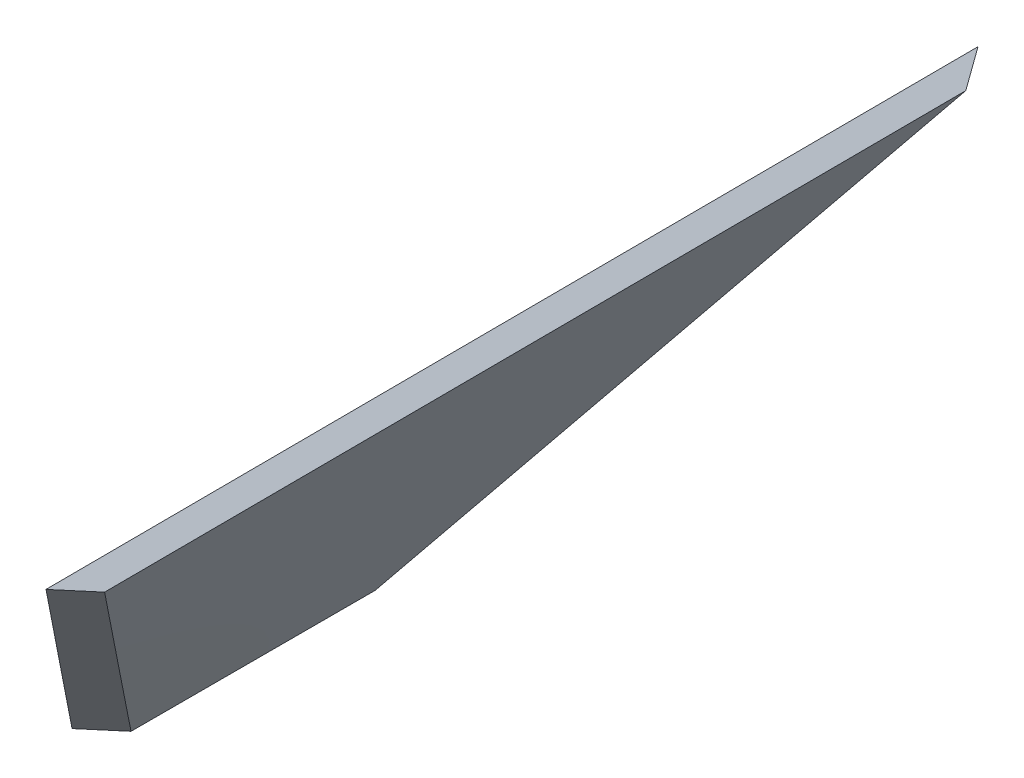
ISO-10303-21;
HEADER;
FILE_DESCRIPTION(('STEP AP214'),'2;1');
FILE_NAME('part.step','',(''),(''),'','','');
FILE_SCHEMA(('AUTOMOTIVE_DESIGN { 1 0 10303 214 1 1 1 1 }'));
ENDSEC;
DATA;
#1=APPLICATION_CONTEXT('core data for automotive mechanical design processes');
#2=APPLICATION_PROTOCOL_DEFINITION('international standard','automotive_design',2000,#1);
#3=PRODUCT_CONTEXT('',#1,'mechanical');
#4=PRODUCT('Part','Part','',(#3));
#5=PRODUCT_RELATED_PRODUCT_CATEGORY('part','',(#4));
#6=PRODUCT_DEFINITION_FORMATION('','',#4);
#7=PRODUCT_DEFINITION_CONTEXT('part definition',#1,'design');
#8=PRODUCT_DEFINITION('design','',#6,#7);
#9=PRODUCT_DEFINITION_SHAPE('','',#8);
#10=(LENGTH_UNIT() NAMED_UNIT(*) SI_UNIT(.MILLI.,.METRE.));
#11=(NAMED_UNIT(*) PLANE_ANGLE_UNIT() SI_UNIT($,.RADIAN.));
#12=(NAMED_UNIT(*) SI_UNIT($,.STERADIAN.) SOLID_ANGLE_UNIT());
#13=UNCERTAINTY_MEASURE_WITH_UNIT(LENGTH_MEASURE(1.E-05),#10,'distance_accuracy_value','');
#14=(GEOMETRIC_REPRESENTATION_CONTEXT(3) GLOBAL_UNCERTAINTY_ASSIGNED_CONTEXT((#13)) GLOBAL_UNIT_ASSIGNED_CONTEXT((#10,
#11,#12)) REPRESENTATION_CONTEXT('',''));
#15=CARTESIAN_POINT('',(0.,0.,0.));
#16=DIRECTION('',(0.,0.,1.));
#17=DIRECTION('',(1.,0.,0.));
#18=AXIS2_PLACEMENT_3D('',#15,#16,#17);
#19=CARTESIAN_POINT('',(255.683748074746,361.646186737307,597.997319736598));
#20=DIRECTION('',(-0.463959634932353,0.757671489646803,-0.458993868074326));
#21=DIRECTION('',(0.852811638118461,0.522218641844302,0.));
#22=AXIS2_PLACEMENT_3D('',#19,#20,#21);
#23=PLANE('',#22);
#24=CARTESIAN_POINT('',(85.6116867373077,31.4461867373069,224.84079999998));
#25=CARTESIAN_POINT('',(87.0565588673166,30.2878880010275,221.468266328822));
#26=CARTESIAN_POINT('',(88.5018005266442,29.1298559686928,218.095799384672));
#27=CARTESIAN_POINT('',(90.6702176814584,27.3932082761787,213.037199178424));
#28=CARTESIAN_POINT('',(91.3931158628378,26.81439242296,211.351015767494));
#29=CARTESIAN_POINT('',(92.8390971677843,25.6568942252864,207.978682388508));
#30=CARTESIAN_POINT('',(93.5621802913542,25.0782118808334,206.292532420452));
#31=CARTESIAN_POINT('',(94.2853559086845,24.4995963224338,204.606399203203));
#32=B_SPLINE_CURVE_WITH_KNOTS('',3,(#24,#25,#26,#27,#28,#29,#30,#31),.UNSPECIFIED.,.F.,.F.,(4,2,
2,4),(0.,11.5425149767635,17.3137727652761,23.0850306366586),.UNSPECIFIED.);
#33=CARTESIAN_POINT('',(85.6116867373077,31.4461867373068,224.84079999998));
#34=VERTEX_POINT('',#33);
#35=CARTESIAN_POINT('',(94.285355924013,24.4995963101699,204.606399133237));
#36=VERTEX_POINT('',#35);
#37=EDGE_CURVE('E99',#34,#36,#32,.T.);
#38=ORIENTED_EDGE('',*,*,#37,.T.);
#39=CARTESIAN_POINT('',(358.92026981327,354.715030361774,482.202486275097));
#40=CARTESIAN_POINT('',(347.891392345303,340.956005258965,470.638351215407));
#41=CARTESIAN_POINT('',(336.862607918635,327.196982025532,459.074125193643));
#42=CARTESIAN_POINT('',(314.80530488357,299.678940859668,435.945413206486));
#43=CARTESIAN_POINT('',(303.776786275174,285.919922927235,424.380927241093));
#44=CARTESIAN_POINT('',(281.720094689012,258.401894021288,401.251617427607));
#45=CARTESIAN_POINT('',(270.691921711246,244.642883047773,389.686793579513));
#46=CARTESIAN_POINT('',(254.150019907439,224.004373818465,372.33920821136));
#47=CARTESIAN_POINT('',(248.636112258375,217.124871957668,366.556621498115));
#48=CARTESIAN_POINT('',(237.608439459981,203.365871104043,354.991308764435));
#49=CARTESIAN_POINT('',(232.094674310651,196.486372111216,349.208582744001));
#50=CARTESIAN_POINT('',(215.553631934114,175.847879682878,331.860156384337));
#51=CARTESIAN_POINT('',(204.526608234026,162.088891366017,320.294208224598));
#52=CARTESIAN_POINT('',(182.473555166235,134.570934893792,297.161340096279));
#53=CARTESIAN_POINT('',(171.447525798529,120.811966738428,285.594420127702));
#54=CARTESIAN_POINT('',(154.909671051817,100.173538546136,268.24287768774));
#55=CARTESIAN_POINT('',(149.397250970578,93.2940664266607,262.458836407628));
#56=CARTESIAN_POINT('',(138.37293270181,79.5351328318868,250.890243878003));
#57=CARTESIAN_POINT('',(132.861034514281,72.6556713565878,245.105692628492));
#58=CARTESIAN_POINT('',(121.837920364888,58.896762257468,233.535923387881));
#59=CARTESIAN_POINT('',(116.326704403032,52.0173146336474,227.750705396774));
#60=CARTESIAN_POINT('',(105.305236604595,38.2584391571064,216.179327495199));
#61=CARTESIAN_POINT('',(99.7949847680189,31.3790113043861,210.393167584724));
#62=CARTESIAN_POINT('',(94.2853559425244,24.4995962953363,204.606399124266));
#63=B_SPLINE_CURVE_WITH_KNOTS('',3,(#39,#40,#41,#42,#43,#44,#45,#46,#47,#48,#49,#50,#51,#52,#53,
#54,#55,#56,#57,#58,#59,#60,#61,#62),.UNSPECIFIED.,.F.,.F.,(4,2,2,2,2,2,2,2,2,2,2,4),(0.,
63.2620357498309,126.524071717887,189.78610768251,221.417125568464,253.048143487038,
316.310181938092,379.572220176311,411.203239867122,442.834259501264,474.465279543079,
506.096299780958),.UNSPECIFIED.);
#64=CARTESIAN_POINT('',(358.920269813023,354.715030361971,482.202486275138));
#65=VERTEX_POINT('',#64);
#66=EDGE_CURVE('E219',#65,#36,#63,.T.);
#67=ORIENTED_EDGE('',*,*,#66,.F.);
#68=CARTESIAN_POINT('',(358.920269811262,354.715030365189,482.202486292587));
#69=CARTESIAN_POINT('',(358.196405083762,355.298372315029,483.897118030486));
#70=CARTESIAN_POINT('',(357.47255102983,355.881721957202,485.591751679707));
#71=CARTESIAN_POINT('',(355.662942576478,357.340115293348,489.828340580871));
#72=CARTESIAN_POINT('',(354.577201518018,358.215168602499,492.370298221353));
#73=CARTESIAN_POINT('',(352.405767422695,359.965309834519,497.454222098826));
#74=CARTESIAN_POINT('',(351.320074385833,360.840397757388,499.996188335817));
#75=CARTESIAN_POINT('',(350.234405357301,361.715502986283,502.538158868865));
#76=B_SPLINE_CURVE_WITH_KNOTS('',3,(#68,#69,#70,#71,#72,#73,#74,#75),.UNSPECIFIED.,.F.,.F.,(4,2,
2,4),(0.,5.79865521575473,14.4966380429352,23.1946208738173),.UNSPECIFIED.);
#77=CARTESIAN_POINT('',(350.320400258716,361.646186737307,502.336811715639));
#78=VERTEX_POINT('',#77);
#79=EDGE_CURVE('E211',#65,#78,#76,.T.);
#80=ORIENTED_EDGE('',*,*,#79,.T.);
#81=DIRECTION('',(0.523067455693957,0.652478989348328,0.54833530367179));
#82=VECTOR('',#81,1.);
#83=CARTESIAN_POINT('',(85.6116867373077,31.4461867373068,224.84079999998));
#84=LINE('',#83,#82);
#85=EDGE_CURVE('E144',#34,#78,#84,.T.);
#86=ORIENTED_EDGE('',*,*,#85,.F.);
#87=EDGE_LOOP('',(#38,#67,#80,#86));
#88=FACE_BOUND('',#87,.T.);
#89=ADVANCED_FACE('F41',(#88),#23,.F.);
#90=CARTESIAN_POINT('',(252.903016686641,361.646186737307,-51.3842000000199));
#91=DIRECTION('',(-0.599439623726809,0.526033966837768,0.603291308771462));
#92=DIRECTION('',(0.70936761741224,0.,0.704838693153889));
#93=AXIS2_PLACEMENT_3D('',#90,#91,#92);
#94=PLANE('',#93);
#95=CARTESIAN_POINT('',(94.304860970554,24.5240211053084,84.9805878131042));
#96=CARTESIAN_POINT('',(93.4303889102284,25.2208364465962,83.5041174446744));
#97=CARTESIAN_POINT('',(92.5558413778993,25.917562724937,82.0276497436559));
#98=CARTESIAN_POINT('',(90.8065953445564,27.3108370997331,79.074719700742));
#99=CARTESIAN_POINT('',(89.9318968435425,28.0073851961885,77.5982573588466));
#100=CARTESIAN_POINT('',(87.9087742541968,29.618111959535,74.1835938247066));
#101=CARTESIAN_POINT('',(86.7602955606541,30.5322261685133,72.2453945793234));
#102=CARTESIAN_POINT('',(85.6116867373077,31.4461867373068,70.3072000000031));
#103=B_SPLINE_CURVE_WITH_KNOTS('',3,(#95,#96,#97,#98,#99,#100,#101,#102),.UNSPECIFIED.,.F.,.F.,
(4,2,2,4),(0.,5.55625410942713,11.1125082188599,18.4064110991942),.UNSPECIFIED.);
#104=CARTESIAN_POINT('',(94.3048609872856,24.5240210919576,84.9805878771799));
#105=VERTEX_POINT('',#104);
#106=CARTESIAN_POINT('',(85.6116867373077,31.4461867373069,70.3072000000032));
#107=VERTEX_POINT('',#106);
#108=EDGE_CURVE('E93',#105,#107,#103,.T.);
#109=ORIENTED_EDGE('',*,*,#108,.T.);
#110=CARTESIAN_POINT('',(85.6116867373077,31.4461867373069,70.3072000000032));
#111=CARTESIAN_POINT('',(173.192933918056,141.512853403974,61.3577333837525));
#112=CARTESIAN_POINT('',(260.774181098805,251.57952007064,52.4082667675018));
#113=CARTESIAN_POINT('',(348.355428279554,361.646186737307,43.4588001512512));
#114=B_SPLINE_CURVE_WITH_KNOTS('',3,(#110,#111,#112,#113),.UNSPECIFIED.,.F.,.F.,(4,4),(0.,1.),.UNSPECIFIED.);
#115=CARTESIAN_POINT('',(348.355428279554,361.646186737307,43.4588001512512));
#116=VERTEX_POINT('',#115);
#117=EDGE_CURVE('E55',#116,#107,#114,.F.);
#118=ORIENTED_EDGE('',*,*,#117,.F.);
#119=CARTESIAN_POINT('',(348.267855212258,361.715396548804,43.3114393706436));
#120=CARTESIAN_POINT('',(349.153997588053,361.01507174552,44.8025655870863));
#121=CARTESIAN_POINT('',(350.040131281007,360.314736665407,46.2936921369052));
#122=CARTESIAN_POINT('',(351.812381282183,358.914045929324,49.2759459037175));
#123=CARTESIAN_POINT('',(352.698497590404,358.213690273355,50.7670731207108));
#124=CARTESIAN_POINT('',(354.760572252051,356.583857869968,54.2370990157827));
#125=CARTESIAN_POINT('',(355.936523981288,355.654373282568,56.2159979479603));
#126=CARTESIAN_POINT('',(357.112460362172,354.724870530214,58.1948974685286));
#127=B_SPLINE_CURVE_WITH_KNOTS('',3,(#119,#120,#121,#122,#123,#124,#125,#126),.UNSPECIFIED.,.F.,
.F.,(4,2,2,4),(0.,5.61181296927187,11.223625938543,18.67114938307),.UNSPECIFIED.);
#128=CARTESIAN_POINT('',(357.112460361956,354.724870530387,58.1948974685605));
#129=VERTEX_POINT('',#128);
#130=EDGE_CURVE('E61',#116,#129,#127,.T.);
#131=ORIENTED_EDGE('',*,*,#130,.T.);
#132=CARTESIAN_POINT('',(94.3048610044559,24.5240210782813,84.9805878703557));
#133=CARTESIAN_POINT('',(100.738161467734,32.6032944890206,84.3281716550605));
#134=CARTESIAN_POINT('',(107.171076861141,40.6828254278652,83.6751482792375));
#135=CARTESIAN_POINT('',(120.036326940221,56.8422755321543,82.3681860169654));
#136=CARTESIAN_POINT('',(126.468661625897,64.9221946975969,81.7142471305206));
#137=CARTESIAN_POINT('',(139.332939721525,81.0822944254595,80.4057526574462));
#138=CARTESIAN_POINT('',(145.764883131481,89.1624749878769,79.7511970708225));
#139=CARTESIAN_POINT('',(158.628478678002,105.323030772402,78.4416267521899));
#140=CARTESIAN_POINT('',(165.060130814567,113.403405994509,77.7866120201804));
#141=CARTESIAN_POINT('',(184.354764973938,137.644746444643,75.8210603525724));
#142=CARTESIAN_POINT('',(197.217425017063,153.805926796476,74.5100159178542));
#143=CARTESIAN_POINT('',(222.942228034198,186.128632993615,71.8871120308464));
#144=CARTESIAN_POINT('',(235.804371008205,202.290158838921,70.5752525785529));
#145=CARTESIAN_POINT('',(266.741194912394,241.163644387196,67.4192055749633));
#146=CARTESIAN_POINT('',(284.815711282716,263.875713996414,65.57475868275));
#147=CARTESIAN_POINT('',(311.927188783889,297.944016617368,62.8076203618809));
#148=CARTESIAN_POINT('',(320.964298400614,309.300150473664,61.8851629287145));
#149=CARTESIAN_POINT('',(339.03843613346,332.012472606491,60.0401196309235));
#150=CARTESIAN_POINT('',(348.07546424958,343.36866088302,59.117533766299));
#151=CARTESIAN_POINT('',(357.112460362172,354.724870530214,58.1948974685287));
#152=B_SPLINE_CURVE_WITH_KNOTS('',3,(#132,#133,#134,#135,#136,#137,#138,#139,#140,#141,#142,
#143,#144,#145,#146,#147,#148,#149,#150,#151),.UNSPECIFIED.,.F.,.F.,(4,2,2,2,2,2,2,2,2,4),(0.,
31.0449503049171,62.0899004607837,93.1348503185234,124.179800219281,186.269698714486,
248.359597500722,335.614133696545,379.241401395875,422.868669086589),.UNSPECIFIED.);
#153=EDGE_CURVE('E95',#105,#129,#152,.T.);
#154=ORIENTED_EDGE('',*,*,#153,.F.);
#155=EDGE_LOOP('',(#109,#118,#131,#154));
#156=FACE_BOUND('',#155,.T.);
#157=ADVANCED_FACE('F94',(#156),#94,.F.);
#158=CARTESIAN_POINT('',(85.6116867373077,31.4461867373069,224.84079999998));
#159=CARTESIAN_POINT('',(85.6116867373077,31.4461867373069,173.329599999988));
#160=CARTESIAN_POINT('',(85.6116867373077,31.4461867373069,121.818399999995));
#161=CARTESIAN_POINT('',(85.6116867373077,31.4461867373069,70.3072000000032));
#162=CARTESIAN_POINT('',(173.847924577777,141.512853403974,317.339470571867));
#163=CARTESIAN_POINT('',(173.62959435787,141.512853403974,232.012224842495));
#164=CARTESIAN_POINT('',(173.411264137963,141.512853403974,146.684979113124));
#165=CARTESIAN_POINT('',(173.192933918056,141.512853403974,61.3577333837525));
#166=CARTESIAN_POINT('',(262.084162418247,251.57952007064,409.838141143753));
#167=CARTESIAN_POINT('',(261.647501978433,251.57952007064,290.694849685003));
#168=CARTESIAN_POINT('',(261.210841538619,251.57952007064,171.551558226252));
#169=CARTESIAN_POINT('',(260.774181098805,251.57952007064,52.4082667675018));
#170=CARTESIAN_POINT('',(350.320400258716,361.646186737307,502.336811715639));
#171=CARTESIAN_POINT('',(349.665409598995,361.646186737307,349.37747452751));
#172=CARTESIAN_POINT('',(349.010418939275,361.646186737307,196.418137339381));
#173=CARTESIAN_POINT('',(348.355428279554,361.646186737307,43.4588001512512));
#174=B_SPLINE_SURFACE_WITH_KNOTS('',3,3,((#158,#159,#160,#161),(#162,#163,#164,#165),(#166,#167,
#168,#169),(#170,#171,#172,#173)),.UNSPECIFIED.,.F.,.F.,.F.,(4,4),(4,4),(0.,1.),(0.,1.),.UNSPECIFIED.);
#175=CARTESIAN_POINT('',(350.320400258716,361.646186737307,502.336811715639));
#176=CARTESIAN_POINT('',(349.665409598995,361.646186737307,349.37747452751));
#177=CARTESIAN_POINT('',(349.010418939275,361.646186737307,196.418137339381));
#178=CARTESIAN_POINT('',(348.355428279554,361.646186737307,43.4588001512512));
#179=B_SPLINE_CURVE_WITH_KNOTS('',3,(#175,#176,#177,#178),.UNSPECIFIED.,.F.,.F.,(4,4),(0.,1.),.UNSPECIFIED.);
#180=EDGE_CURVE('E88',#78,#116,#179,.T.);
#181=CARTESIAN_POINT('',(85.6116867373077,31.4461867373069,70.3072000000032));
#182=CARTESIAN_POINT('',(85.6116867373077,31.4461867373069,121.818399999995));
#183=CARTESIAN_POINT('',(85.6116867373077,31.4461867373069,173.329599999988));
#184=CARTESIAN_POINT('',(85.6116867373077,31.4461867373069,224.84079999998));
#185=B_SPLINE_CURVE_WITH_KNOTS('',3,(#181,#182,#183,#184),.UNSPECIFIED.,.F.,.F.,(4,4),(0.,1.),.UNSPECIFIED.);
#186=EDGE_CURVE('E11',#107,#34,#185,.T.);
#187=ORIENTED_EDGE('',*,*,#85,.T.);
#188=ORIENTED_EDGE('',*,*,#180,.T.);
#189=ORIENTED_EDGE('',*,*,#117,.T.);
#190=ORIENTED_EDGE('',*,*,#186,.T.);
#191=EDGE_LOOP('',(#187,#188,#189,#190));
#192=FACE_BOUND('',#191,.T.);
#193=ADVANCED_FACE('F85',(#192),#174,.T.);
#194=CARTESIAN_POINT('',(350.253195264404,361.715504021864,506.925963753832));
#195=CARTESIAN_POINT('',(350.246645074935,361.715503667409,505.396370383162));
#196=CARTESIAN_POINT('',(350.240094885465,361.715503312954,503.866777012492));
#197=CARTESIAN_POINT('',(350.233544695996,361.715502958499,502.337183641822));
#198=CARTESIAN_POINT('',(349.578525749051,361.715467513005,349.377846574822));
#199=CARTESIAN_POINT('',(348.923506796167,361.715432015562,196.418509507847));
#200=CARTESIAN_POINT('',(348.268487837452,361.715396466049,43.4591724408974));
#201=CARTESIAN_POINT('',(348.261937647864,361.715396110553,41.9295790702279));
#202=CARTESIAN_POINT('',(348.255387458277,361.715395755058,40.3999856995584));
#203=CARTESIAN_POINT('',(348.24883726869,361.715395399563,38.8703923288889));
#204=CARTESIAN_POINT('',(350.340049978508,361.646186737307,506.925591831283));
#205=CARTESIAN_POINT('',(350.333500071911,361.646186737307,505.395998459402));
#206=CARTESIAN_POINT('',(350.326950165314,361.646186737307,503.866405087521));
#207=CARTESIAN_POINT('',(350.320400258716,361.646186737307,502.336811715639));
#208=CARTESIAN_POINT('',(349.665409598995,361.646186737307,349.37747452751));
#209=CARTESIAN_POINT('',(349.010418939275,361.646186737307,196.418137339381));
#210=CARTESIAN_POINT('',(348.355428279554,361.646186737307,43.4588001512512));
#211=CARTESIAN_POINT('',(348.348878372957,361.646186737307,41.9292067793699));
#212=CARTESIAN_POINT('',(348.342328466359,361.646186737307,40.3996134074886));
#213=CARTESIAN_POINT('',(348.335778559762,361.646186737307,38.8700200356073));
#214=CARTESIAN_POINT('',(359.025521388904,354.714458281584,506.888399576442));
#215=CARTESIAN_POINT('',(359.01899976953,354.714493727079,505.358806083431));
#216=CARTESIAN_POINT('',(359.012478150157,354.714529172574,503.829212590421));
#217=CARTESIAN_POINT('',(359.005956530783,354.714564618068,502.29961909741));
#218=CARTESIAN_POINT('',(358.353794593399,354.718109167544,349.340269796345));
#219=CARTESIAN_POINT('',(357.701633250067,354.72165891179,196.380920492734));
#220=CARTESIAN_POINT('',(357.049472489765,354.725213863131,43.4215711866285));
#221=CARTESIAN_POINT('',(357.042950882162,354.725249412644,41.8919776935674));
#222=CARTESIAN_POINT('',(357.036429274559,354.725284962158,40.3623842005063));
#223=CARTESIAN_POINT('',(357.029907666956,354.725320511671,38.8327907074453));
#224=B_SPLINE_SURFACE_WITH_KNOTS('',1,3,((#194,#195,#196,#197,#198,#199,#200,#201,#202,#203),
(#204,#205,#206,#207,#208,#209,#210,#211,#212,#213),(#214,#215,#216,#217,#218,#219,#220,#221,
#222,#223)),.UNSPECIFIED.,.F.,.F.,.F.,(2,1,2),(4,3,3,4),(-0.01,0.,1.),(-0.01,0.,1.,1.01),.UNSPECIFIED.);
#225=CARTESIAN_POINT('',(358.920269812777,354.715030362167,482.20248627513));
#226=CARTESIAN_POINT('',(358.844944355998,354.715439814314,464.535503408457));
#227=CARTESIAN_POINT('',(358.769618907137,354.715849335768,446.868520541752));
#228=CARTESIAN_POINT('',(358.618968025219,354.716668517331,411.534554808275));
#229=CARTESIAN_POINT('',(358.543642592161,354.717078177439,393.867571941502));
#230=CARTESIAN_POINT('',(358.392991741815,354.717897636348,358.53360620789));
#231=CARTESIAN_POINT('',(358.317666324527,354.718307435149,340.86662334105));
#232=CARTESIAN_POINT('',(358.167015505685,354.719127171481,305.532657607302));
#233=CARTESIAN_POINT('',(358.091690104132,354.719537109012,287.865674740395));
#234=CARTESIAN_POINT('',(357.941039316727,354.720357122842,252.531709006513));
#235=CARTESIAN_POINT('',(357.865713930875,354.720767199141,234.864726139538));
#236=CARTESIAN_POINT('',(357.715063174838,354.721587490546,199.530760405521));
#237=CARTESIAN_POINT('',(357.639737804653,354.721997705651,181.86377753848));
#238=CARTESIAN_POINT('',(357.489087079917,354.722818274706,146.529811804329));
#239=CARTESIAN_POINT('',(357.413761725365,354.723228628655,128.86282893722));
#240=CARTESIAN_POINT('',(357.263111031861,354.724049475436,93.5288632029362));
#241=CARTESIAN_POINT('',(357.187785692909,354.724459968268,75.8618803357608));
#242=CARTESIAN_POINT('',(357.112460361739,354.72487053056,58.1948974685537));
#243=B_SPLINE_CURVE_WITH_KNOTS('',3,(#225,#226,#227,#228,#229,#230,#231,#232,#233,#234,#235,
#236,#237,#238,#239,#240,#241,#242),.UNSPECIFIED.,.F.,.F.,(4,2,2,2,2,2,2,2,4),(0.,
53.0014303517421,106.002860703495,159.004291055258,212.005721407032,265.007151758816,
318.008582110611,371.010012462416,424.011442814232),.UNSPECIFIED.);
#244=EDGE_CURVE('E241',#65,#129,#243,.T.);
#245=ORIENTED_EDGE('',*,*,#130,.F.);
#246=ORIENTED_EDGE('',*,*,#180,.F.);
#247=ORIENTED_EDGE('',*,*,#79,.F.);
#248=ORIENTED_EDGE('',*,*,#244,.T.);
#249=EDGE_LOOP('',(#245,#246,#247,#248));
#250=FACE_BOUND('',#249,.T.);
#251=ADVANCED_FACE('F125',(#250),#224,.T.);
#252=CARTESIAN_POINT('',(85.6116867373077,31.4461867373069,230.451572510383));
#253=CARTESIAN_POINT('',(85.6116867373077,31.4461867373069,229.905322987356));
#254=CARTESIAN_POINT('',(85.6116867373077,31.4461867373069,229.359073464329));
#255=CARTESIAN_POINT('',(85.6116867373077,31.4461867373069,228.812823941302));
#256=CARTESIAN_POINT('',(85.6116867373077,31.4461867373069,227.488815960862));
#257=CARTESIAN_POINT('',(85.6116867373077,31.4461867373069,226.164807980421));
#258=CARTESIAN_POINT('',(85.6116867373077,31.4461867373069,224.84079999998));
#259=CARTESIAN_POINT('',(85.6116867373077,31.4461867373069,173.329599999988));
#260=CARTESIAN_POINT('',(85.6116867373077,31.4461867373069,121.818399999995));
#261=CARTESIAN_POINT('',(85.6116867373077,31.4461867373069,70.3072000000032));
#262=CARTESIAN_POINT('',(85.6116867373077,31.4461867373069,69.0582967896457));
#263=CARTESIAN_POINT('',(85.6116867373077,31.4461867373069,67.8093935792882));
#264=CARTESIAN_POINT('',(85.6116867373077,31.4461867373069,66.5604903689307));
#265=CARTESIAN_POINT('',(85.6116867373077,31.4461867373069,66.0196492570227));
#266=CARTESIAN_POINT('',(85.6116867373077,31.4461867373069,65.4788081451148));
#267=CARTESIAN_POINT('',(85.6116867373077,31.4461867373069,64.9379670332069));
#268=CARTESIAN_POINT('',(94.2811443606363,24.4943407304016,230.451572510383));
#269=CARTESIAN_POINT('',(94.2812333684707,24.4944517595647,229.905322987356));
#270=CARTESIAN_POINT('',(94.2813223763052,24.4945627887279,229.359073464329));
#271=CARTESIAN_POINT('',(94.2814113841396,24.494673817891,228.812823941302));
#272=CARTESIAN_POINT('',(94.2816271226953,24.4949429320812,227.488815960862));
#273=CARTESIAN_POINT('',(94.281842861251,24.4952120462714,226.164807980421));
#274=CARTESIAN_POINT('',(94.2820585998066,24.4954811604616,224.84079999998));
#275=CARTESIAN_POINT('',(94.2904520174086,24.5059511841163,173.329599999988));
#276=CARTESIAN_POINT('',(94.2988508466847,24.51646681801,121.818399999995));
#277=CARTESIAN_POINT('',(94.3072548008999,24.5270283852068,70.3072000000032));
#278=CARTESIAN_POINT('',(94.307458557081,24.527284453308,69.0582967896457));
#279=CARTESIAN_POINT('',(94.3076623132622,24.5275405214093,67.8093935792882));
#280=CARTESIAN_POINT('',(94.3078660694433,24.5277965895106,66.5604903689307));
#281=CARTESIAN_POINT('',(94.3079543066411,24.5279074805352,66.0196492570227));
#282=CARTESIAN_POINT('',(94.3080425438389,24.5280183715598,65.4788081451148));
#283=CARTESIAN_POINT('',(94.3081307810367,24.5281292625844,64.9379670332069));
#284=B_SPLINE_SURFACE_WITH_KNOTS('',1,3,((#252,#253,#254,#255,#256,#257,#258,#259,#260,#261,
#262,#263,#264,#265,#266,#267),(#268,#269,#270,#271,#272,#273,#274,#275,#276,#277,#278,#279,
#280,#281,#282,#283)),.UNSPECIFIED.,.F.,.F.,.F.,(2,2),(4,3,3,3,3,4),(0.,1.),
(-0.0363077836173099,-0.0257033029795639,0.,1.,1.0242452750151,1.03474476079504),.UNSPECIFIED.);
#285=CARTESIAN_POINT('',(94.3048609701166,24.5240211056357,84.9805878754234));
#286=CARTESIAN_POINT('',(94.304047867623,24.5229999743256,89.964996677629));
#287=CARTESIAN_POINT('',(94.3032348133701,24.5219792728106,94.9494054799305));
#288=CARTESIAN_POINT('',(94.3016088018653,24.5199387287856,104.918223084534));
#289=CARTESIAN_POINT('',(94.3007958446135,24.5189188862756,109.902631886835));
#290=CARTESIAN_POINT('',(94.2991700276304,24.5168800596751,119.871449491438));
#291=CARTESIAN_POINT('',(94.2983571678992,24.5158610755847,124.85585829374));
#292=CARTESIAN_POINT('',(94.296731546477,24.5138239652381,134.824675898343));
#293=CARTESIAN_POINT('',(94.2959187847861,24.5128058389818,139.809084700644));
#294=CARTESIAN_POINT('',(94.2942933599639,24.5107704437182,149.777902305248));
#295=CARTESIAN_POINT('',(94.2934806968327,24.5097531747107,154.762311107549));
#296=CARTESIAN_POINT('',(94.2918554696497,24.5077194933592,164.731128712152));
#297=CARTESIAN_POINT('',(94.2910429055979,24.5067030810151,169.715537514454));
#298=CARTESIAN_POINT('',(94.2894178770932,24.504671112405,179.684355119057));
#299=CARTESIAN_POINT('',(94.2886054126404,24.5036555561389,184.668763921358));
#300=CARTESIAN_POINT('',(94.2869805838531,24.5016252990992,194.637581525961));
#301=CARTESIAN_POINT('',(94.2861682195187,24.5006105983257,199.621990328263));
#302=CARTESIAN_POINT('',(94.2853559055034,24.4995963250058,204.60639913066));
#303=B_SPLINE_CURVE_WITH_KNOTS('',3,(#285,#286,#287,#288,#289,#290,#291,#292,#293,#294,#295,
#296,#297,#298,#299,#300,#301,#302),.UNSPECIFIED.,.F.,.F.,(4,2,2,2,2,2,2,2,4),(0.,
14.9532269193691,29.9064538381634,44.8596807563831,59.8129076740291,74.7661345911017,
89.7193615076017,104.672588423529,119.625815338885),.UNSPECIFIED.);
#304=EDGE_CURVE('E147',#105,#36,#303,.T.);
#305=ORIENTED_EDGE('',*,*,#108,.F.);
#306=ORIENTED_EDGE('',*,*,#304,.T.);
#307=ORIENTED_EDGE('',*,*,#37,.F.);
#308=ORIENTED_EDGE('',*,*,#186,.F.);
#309=EDGE_LOOP('',(#305,#306,#307,#308));
#310=FACE_BOUND('',#309,.T.);
#311=ADVANCED_FACE('F103',(#310),#284,.F.);
#312=CARTESIAN_POINT('',(85.6116867373077,31.4461867373069,233.752678933035));
#313=CARTESIAN_POINT('',(85.6116867373077,31.4461867373069,231.302315742016));
#314=CARTESIAN_POINT('',(85.6116867373077,31.4461867373069,228.851952550998));
#315=CARTESIAN_POINT('',(85.6116867373077,31.4461867373069,225.88132623998));
#316=CARTESIAN_POINT('',(85.6116867373077,31.4461867373069,225.36106311998));
#317=CARTESIAN_POINT('',(85.6116867373077,31.4461867373069,173.329599999988));
#318=CARTESIAN_POINT('',(85.6116867373077,31.4461867373069,121.818399999995));
#319=CARTESIAN_POINT('',(85.6116867373077,31.4461867373069,69.7920880000032));
#320=CARTESIAN_POINT('',(85.6116867373077,31.4461867373069,69.2769760000033));
#321=CARTESIAN_POINT('',(85.6116867373077,31.4461867373069,68.0280727896519));
#322=CARTESIAN_POINT('',(85.6116867373077,31.4461867373069,67.2942815793003));
#323=CARTESIAN_POINT('',(85.6116867373077,31.4461867373069,66.5604903689488));
#324=CARTESIAN_POINT('',(173.885697576411,141.512853403974,332.101815142198));
#325=CARTESIAN_POINT('',(173.875311712088,141.512853403974,328.042838800621));
#326=CARTESIAN_POINT('',(173.864925847764,141.512853403974,323.983862459044));
#327=CARTESIAN_POINT('',(173.852334848219,141.512853403974,319.0630809356));
#328=CARTESIAN_POINT('',(173.850129712998,141.512853403974,318.201275753733));
#329=CARTESIAN_POINT('',(173.62959435787,141.512853403974,232.012224842495));
#330=CARTESIAN_POINT('',(173.411264137963,141.512853403974,146.684979113124));
#331=CARTESIAN_POINT('',(173.190750615857,141.512853403974,60.5044609264588));
#332=CARTESIAN_POINT('',(173.188567313658,141.512853403974,59.6511884691651));
#333=CARTESIAN_POINT('',(173.183273837433,141.512853403974,57.5824059301857));
#334=CARTESIAN_POINT('',(173.180163663406,141.512853403974,56.3668958485001));
#335=CARTESIAN_POINT('',(173.177053489379,141.512853403974,55.1513857668144));
#336=CARTESIAN_POINT('',(262.159708415515,251.57952007064,430.450951351362));
#337=CARTESIAN_POINT('',(262.138936686868,251.57952007064,424.783361859226));
#338=CARTESIAN_POINT('',(262.11816495822,251.57952007064,419.115772367089));
#339=CARTESIAN_POINT('',(262.092982959131,251.57952007064,412.24483563122));
#340=CARTESIAN_POINT('',(262.088572688689,251.57952007064,411.041488387486));
#341=CARTESIAN_POINT('',(261.647501978433,251.57952007064,290.694849685003));
#342=CARTESIAN_POINT('',(261.210841538619,251.57952007064,171.551558226252));
#343=CARTESIAN_POINT('',(260.769814494407,251.57952007064,51.2168338529143));
#344=CARTESIAN_POINT('',(260.765447890009,251.57952007064,50.0254009383268));
#345=CARTESIAN_POINT('',(260.754860937557,251.57952007064,47.1367390707195));
#346=CARTESIAN_POINT('',(260.748640589504,251.57952007064,45.4395101176997));
#347=CARTESIAN_POINT('',(260.742420241451,251.57952007064,43.7422811646799));
#348=CARTESIAN_POINT('',(350.433719254618,361.646186737307,528.800087560526));
#349=CARTESIAN_POINT('',(350.402561661647,361.646186737307,521.523884917831));
#350=CARTESIAN_POINT('',(350.371404068677,361.646186737307,514.247682275135));
#351=CARTESIAN_POINT('',(350.333631070043,361.646186737307,505.42659032684));
#352=CARTESIAN_POINT('',(350.32701566438,361.646186737307,503.88170102124));
#353=CARTESIAN_POINT('',(349.665409598995,361.646186737307,349.37747452751));
#354=CARTESIAN_POINT('',(349.010418939275,361.646186737307,196.418137339381));
#355=CARTESIAN_POINT('',(348.348878372957,361.646186737307,41.9292067793699));
#356=CARTESIAN_POINT('',(348.342328466359,361.646186737307,40.3996134074886));
#357=CARTESIAN_POINT('',(348.326448037682,361.646186737307,36.6910722112533));
#358=CARTESIAN_POINT('',(348.317117515602,361.646186737307,34.5121243868994));
#359=CARTESIAN_POINT('',(348.307786993522,361.646186737307,32.3331765625454));
#360=B_SPLINE_SURFACE_WITH_KNOTS('',3,3,((#312,#313,#314,#315,#316,#317,#318,#319,#320,#321,
#322,#323),(#324,#325,#326,#327,#328,#329,#330,#331,#332,#333,#334,#335),(#336,#337,#338,#339,
#340,#341,#342,#343,#344,#345,#346,#347),(#348,#349,#350,#351,#352,#353,#354,#355,#356,#357,
#358,#359)),.UNSPECIFIED.,.F.,.F.,.F.,(4,4),(4,2,2,2,2,4),(0.,1.),(-0.0576695225702109,-0.0101,
0.,1.,1.01,1.02424527501498),.UNSPECIFIED.);
#361=OFFSET_SURFACE('',#360,-11.1125,.F.);
#362=ORIENTED_EDGE('',*,*,#304,.F.);
#363=ORIENTED_EDGE('',*,*,#153,.T.);
#364=ORIENTED_EDGE('',*,*,#244,.F.);
#365=ORIENTED_EDGE('',*,*,#66,.T.);
#366=EDGE_LOOP('',(#362,#363,#364,#365));
#367=FACE_BOUND('',#366,.T.);
#368=ADVANCED_FACE('F226',(#367),#361,.F.);
#369=CLOSED_SHELL('',(#89,#157,#193,#251,#311,#368));
#370=MANIFOLD_SOLID_BREP('B2',#369);
#371=ADVANCED_BREP_SHAPE_REPRESENTATION('',(#18,#370),#14);
#372=SHAPE_DEFINITION_REPRESENTATION(#9,#371);
ENDSEC;
END-ISO-10303-21;
